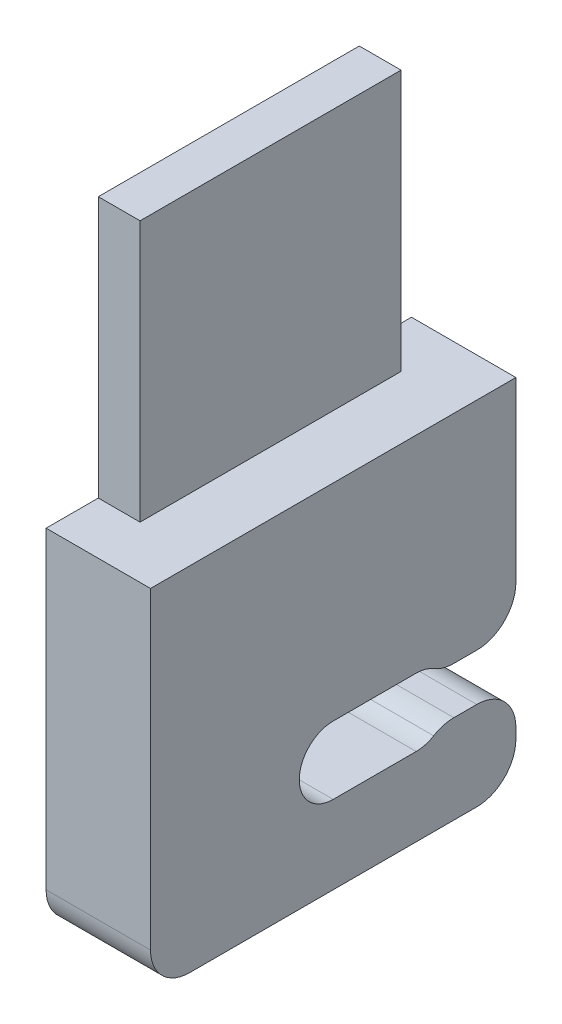
ISO-10303-21;
HEADER;
FILE_DESCRIPTION(('STEP AP214'),'2;1');
FILE_NAME('part.step','',(''),(''),'','','');
FILE_SCHEMA(('AUTOMOTIVE_DESIGN { 1 0 10303 214 1 1 1 1 }'));
ENDSEC;
DATA;
#1=APPLICATION_CONTEXT('core data for automotive mechanical design processes');
#2=APPLICATION_PROTOCOL_DEFINITION('international standard','automotive_design',2000,#1);
#3=PRODUCT_CONTEXT('',#1,'mechanical');
#4=PRODUCT('Part','Part','',(#3));
#5=PRODUCT_RELATED_PRODUCT_CATEGORY('part','',(#4));
#6=PRODUCT_DEFINITION_FORMATION('','',#4);
#7=PRODUCT_DEFINITION_CONTEXT('part definition',#1,'design');
#8=PRODUCT_DEFINITION('design','',#6,#7);
#9=PRODUCT_DEFINITION_SHAPE('','',#8);
#10=(LENGTH_UNIT() NAMED_UNIT(*) SI_UNIT(.MILLI.,.METRE.));
#11=(NAMED_UNIT(*) PLANE_ANGLE_UNIT() SI_UNIT($,.RADIAN.));
#12=(NAMED_UNIT(*) SI_UNIT($,.STERADIAN.) SOLID_ANGLE_UNIT());
#13=UNCERTAINTY_MEASURE_WITH_UNIT(LENGTH_MEASURE(1.E-05),#10,'distance_accuracy_value','');
#14=(GEOMETRIC_REPRESENTATION_CONTEXT(3) GLOBAL_UNCERTAINTY_ASSIGNED_CONTEXT((#13)) GLOBAL_UNIT_ASSIGNED_CONTEXT((#10,
#11,#12)) REPRESENTATION_CONTEXT('',''));
#15=CARTESIAN_POINT('',(0.,0.,0.));
#16=DIRECTION('',(0.,0.,1.));
#17=DIRECTION('',(1.,0.,0.));
#18=AXIS2_PLACEMENT_3D('',#15,#16,#17);
#19=CARTESIAN_POINT('',(1.6,0.,-10.));
#20=DIRECTION('',(0.,0.,1.));
#21=DIRECTION('',(0.,-1.,0.));
#22=AXIS2_PLACEMENT_3D('',#19,#20,#21);
#23=PLANE('',#22);
#24=DIRECTION('',(1.,0.,0.));
#25=VECTOR('',#24,1.);
#26=CARTESIAN_POINT('',(4.,-10.,-10.));
#27=LINE('',#26,#25);
#28=CARTESIAN_POINT('',(0.,-10.,-10.));
#29=VERTEX_POINT('',#28);
#30=CARTESIAN_POINT('',(1.6,-10.,-10.));
#31=VERTEX_POINT('',#30);
#32=EDGE_CURVE('E293',#29,#31,#27,.T.);
#33=ORIENTED_EDGE('',*,*,#32,.F.);
#34=DIRECTION('',(0.,1.,0.));
#35=VECTOR('',#34,1.);
#36=CARTESIAN_POINT('',(0.,0.,-10.));
#37=LINE('',#36,#35);
#38=CARTESIAN_POINT('',(0.,0.,-10.));
#39=VERTEX_POINT('',#38);
#40=EDGE_CURVE('E344',#29,#39,#37,.T.);
#41=ORIENTED_EDGE('',*,*,#40,.T.);
#42=DIRECTION('',(-1.,0.,0.));
#43=VECTOR('',#42,1.);
#44=CARTESIAN_POINT('',(1.6,0.,-10.));
#45=LINE('',#44,#43);
#46=CARTESIAN_POINT('',(1.6,0.,-10.));
#47=VERTEX_POINT('',#46);
#48=EDGE_CURVE('E319',#47,#39,#45,.T.);
#49=ORIENTED_EDGE('',*,*,#48,.F.);
#50=DIRECTION('',(0.,1.,0.));
#51=VECTOR('',#50,1.);
#52=CARTESIAN_POINT('',(1.6,0.,-10.));
#53=LINE('',#52,#51);
#54=EDGE_CURVE('E335',#31,#47,#53,.T.);
#55=ORIENTED_EDGE('',*,*,#54,.F.);
#56=EDGE_LOOP('',(#33,#41,#49,#55));
#57=FACE_BOUND('',#56,.T.);
#58=ADVANCED_FACE('F45',(#57),#23,.F.);
#59=CARTESIAN_POINT('',(1.6,0.,0.));
#60=DIRECTION('',(0.,0.,-1.));
#61=DIRECTION('',(-1.,0.,0.));
#62=AXIS2_PLACEMENT_3D('',#59,#60,#61);
#63=PLANE('',#62);
#64=DIRECTION('',(-1.,0.,0.));
#65=VECTOR('',#64,1.);
#66=CARTESIAN_POINT('',(4.,-10.,0.));
#67=LINE('',#66,#65);
#68=CARTESIAN_POINT('',(1.6,-10.,0.));
#69=VERTEX_POINT('',#68);
#70=CARTESIAN_POINT('',(0.,-10.,0.));
#71=VERTEX_POINT('',#70);
#72=EDGE_CURVE('E314',#69,#71,#67,.T.);
#73=ORIENTED_EDGE('',*,*,#72,.F.);
#74=DIRECTION('',(0.,-1.,0.));
#75=VECTOR('',#74,1.);
#76=CARTESIAN_POINT('',(1.6,0.,0.));
#77=LINE('',#76,#75);
#78=CARTESIAN_POINT('',(1.6,0.,0.));
#79=VERTEX_POINT('',#78);
#80=EDGE_CURVE('E326',#79,#69,#77,.T.);
#81=ORIENTED_EDGE('',*,*,#80,.F.);
#82=DIRECTION('',(-1.,0.,0.));
#83=VECTOR('',#82,1.);
#84=CARTESIAN_POINT('',(1.6,0.,0.));
#85=LINE('',#84,#83);
#86=CARTESIAN_POINT('',(0.,0.,0.));
#87=VERTEX_POINT('',#86);
#88=EDGE_CURVE('E341',#79,#87,#85,.T.);
#89=ORIENTED_EDGE('',*,*,#88,.T.);
#90=DIRECTION('',(0.,-1.,0.));
#91=VECTOR('',#90,1.);
#92=CARTESIAN_POINT('',(0.,0.,0.));
#93=LINE('',#92,#91);
#94=EDGE_CURVE('E325',#87,#71,#93,.T.);
#95=ORIENTED_EDGE('',*,*,#94,.T.);
#96=EDGE_LOOP('',(#73,#81,#89,#95));
#97=FACE_BOUND('',#96,.T.);
#98=ADVANCED_FACE('F494',(#97),#63,.F.);
#99=CARTESIAN_POINT('',(1.6,0.,0.));
#100=DIRECTION('',(0.,-1.,0.));
#101=DIRECTION('',(0.,0.,-1.));
#102=AXIS2_PLACEMENT_3D('',#99,#100,#101);
#103=PLANE('',#102);
#104=DIRECTION('',(0.,0.,1.));
#105=VECTOR('',#104,1.);
#106=CARTESIAN_POINT('',(0.,0.,0.));
#107=LINE('',#106,#105);
#108=EDGE_CURVE('E331',#39,#87,#107,.T.);
#109=ORIENTED_EDGE('',*,*,#108,.T.);
#110=ORIENTED_EDGE('',*,*,#88,.F.);
#111=DIRECTION('',(0.,0.,1.));
#112=VECTOR('',#111,1.);
#113=CARTESIAN_POINT('',(1.6,0.,0.));
#114=LINE('',#113,#112);
#115=EDGE_CURVE('E338',#47,#79,#114,.T.);
#116=ORIENTED_EDGE('',*,*,#115,.F.);
#117=ORIENTED_EDGE('',*,*,#48,.T.);
#118=EDGE_LOOP('',(#109,#110,#116,#117));
#119=FACE_BOUND('',#118,.T.);
#120=ADVANCED_FACE('F500',(#119),#103,.F.);
#121=CARTESIAN_POINT('',(1.6,0.,0.));
#122=DIRECTION('',(1.,0.,0.));
#123=DIRECTION('',(0.,0.,-1.));
#124=AXIS2_PLACEMENT_3D('',#121,#122,#123);
#125=PLANE('',#124);
#126=ORIENTED_EDGE('',*,*,#80,.T.);
#127=DIRECTION('',(0.,0.,-1.));
#128=VECTOR('',#127,1.);
#129=CARTESIAN_POINT('',(1.6,-10.,0.));
#130=LINE('',#129,#128);
#131=EDGE_CURVE('E330',#69,#31,#130,.T.);
#132=ORIENTED_EDGE('',*,*,#131,.T.);
#133=ORIENTED_EDGE('',*,*,#54,.T.);
#134=ORIENTED_EDGE('',*,*,#115,.T.);
#135=EDGE_LOOP('',(#126,#132,#133,#134));
#136=FACE_BOUND('',#135,.T.);
#137=ADVANCED_FACE('F606',(#136),#125,.T.);
#138=CARTESIAN_POINT('',(0.,0.,0.));
#139=DIRECTION('',(1.,0.,0.));
#140=DIRECTION('',(0.,0.,-1.));
#141=AXIS2_PLACEMENT_3D('',#138,#139,#140);
#142=PLANE('',#141);
#143=DIRECTION('',(0.,0.,1.));
#144=VECTOR('',#143,1.);
#145=CARTESIAN_POINT('',(0.,-18.3,0.));
#146=LINE('',#145,#144);
#147=CARTESIAN_POINT('',(0.,-18.3,-10.5));
#148=VERTEX_POINT('',#147);
#149=CARTESIAN_POINT('',(0.,-18.3,-9.6222205101856));
#150=VERTEX_POINT('',#149);
#151=EDGE_CURVE('E234',#148,#150,#146,.T.);
#152=ORIENTED_EDGE('',*,*,#151,.T.);
#153=CARTESIAN_POINT('',(0.,-16.8,-9.6222205101856));
#154=DIRECTION('',(1.,0.,0.));
#155=DIRECTION('',(0.,0.,-1.));
#156=AXIS2_PLACEMENT_3D('',#153,#154,#155);
#157=CIRCLE('',#156,1.5);
#158=CARTESIAN_POINT('',(0.,-18.0857142857143,-8.84960237972903));
#159=VERTEX_POINT('',#158);
#160=EDGE_CURVE('E384',#150,#159,#157,.F.);
#161=ORIENTED_EDGE('',*,*,#160,.T.);
#162=CARTESIAN_POINT('',(0.,-19.2,-8.18));
#163=DIRECTION('',(1.,0.,0.));
#164=DIRECTION('',(0.,0.,-1.));
#165=AXIS2_PLACEMENT_3D('',#162,#163,#164);
#166=CIRCLE('',#165,1.3);
#167=CARTESIAN_POINT('',(0.,-17.9,-8.18));
#168=VERTEX_POINT('',#167);
#169=EDGE_CURVE('E443',#168,#159,#166,.F.);
#170=ORIENTED_EDGE('',*,*,#169,.F.);
#171=DIRECTION('',(0.,0.,1.));
#172=VECTOR('',#171,1.);
#173=CARTESIAN_POINT('',(0.,-17.9,0.));
#174=LINE('',#173,#172);
#175=CARTESIAN_POINT('',(0.,-17.9,-5.));
#176=VERTEX_POINT('',#175);
#177=EDGE_CURVE('E441',#168,#176,#174,.T.);
#178=ORIENTED_EDGE('',*,*,#177,.T.);
#179=CARTESIAN_POINT('',(0.,-19.2,-5.));
#180=DIRECTION('',(1.,0.,0.));
#181=DIRECTION('',(0.,0.,-1.));
#182=AXIS2_PLACEMENT_3D('',#179,#180,#181);
#183=CIRCLE('',#182,1.3);
#184=CARTESIAN_POINT('',(0.,-20.5,-5.));
#185=VERTEX_POINT('',#184);
#186=EDGE_CURVE('E437',#185,#176,#183,.F.);
#187=ORIENTED_EDGE('',*,*,#186,.F.);
#188=DIRECTION('',(0.,0.,1.));
#189=VECTOR('',#188,1.);
#190=CARTESIAN_POINT('',(0.,-20.5,0.));
#191=LINE('',#190,#189);
#192=CARTESIAN_POINT('',(0.,-20.5,-8.18));
#193=VERTEX_POINT('',#192);
#194=EDGE_CURVE('E433',#193,#185,#191,.T.);
#195=ORIENTED_EDGE('',*,*,#194,.F.);
#196=CARTESIAN_POINT('',(0.,-19.2,-8.18));
#197=DIRECTION('',(1.,0.,0.));
#198=DIRECTION('',(0.,0.,-1.));
#199=AXIS2_PLACEMENT_3D('',#196,#197,#198);
#200=CIRCLE('',#199,1.3);
#201=CARTESIAN_POINT('',(0.,-20.3142857142857,-8.84960237972903));
#202=VERTEX_POINT('',#201);
#203=EDGE_CURVE('E408',#202,#193,#200,.F.);
#204=ORIENTED_EDGE('',*,*,#203,.F.);
#205=CARTESIAN_POINT('',(0.,-21.6,-9.62222051018559));
#206=DIRECTION('',(1.,0.,0.));
#207=DIRECTION('',(0.,0.,-1.));
#208=AXIS2_PLACEMENT_3D('',#205,#206,#207);
#209=CIRCLE('',#208,1.5);
#210=CARTESIAN_POINT('',(0.,-20.1,-9.62222051018559));
#211=VERTEX_POINT('',#210);
#212=EDGE_CURVE('E67',#202,#211,#209,.F.);
#213=ORIENTED_EDGE('',*,*,#212,.T.);
#214=DIRECTION('',(0.,0.,1.));
#215=VECTOR('',#214,1.);
#216=CARTESIAN_POINT('',(0.,-20.1,0.));
#217=LINE('',#216,#215);
#218=CARTESIAN_POINT('',(0.,-20.1,-10.5));
#219=VERTEX_POINT('',#218);
#220=EDGE_CURVE('E401',#219,#211,#217,.T.);
#221=ORIENTED_EDGE('',*,*,#220,.F.);
#222=CARTESIAN_POINT('',(0.,-21.6,-10.5));
#223=DIRECTION('',(1.,0.,0.));
#224=DIRECTION('',(0.,0.,-1.));
#225=AXIS2_PLACEMENT_3D('',#222,#223,#224);
#226=CIRCLE('',#225,1.5);
#227=CARTESIAN_POINT('',(0.,-21.6,-12.));
#228=VERTEX_POINT('',#227);
#229=EDGE_CURVE('E61',#219,#228,#226,.F.);
#230=ORIENTED_EDGE('',*,*,#229,.T.);
#231=DIRECTION('',(0.,1.,0.));
#232=VECTOR('',#231,1.);
#233=CARTESIAN_POINT('',(0.,0.,-12.));
#234=LINE('',#233,#232);
#235=CARTESIAN_POINT('',(0.,-22.,-12.));
#236=VERTEX_POINT('',#235);
#237=EDGE_CURVE('E409',#236,#228,#234,.T.);
#238=ORIENTED_EDGE('',*,*,#237,.F.);
#239=CARTESIAN_POINT('',(0.,-22.,-10.5));
#240=DIRECTION('',(1.,0.,0.));
#241=DIRECTION('',(0.,0.,-1.));
#242=AXIS2_PLACEMENT_3D('',#239,#240,#241);
#243=CIRCLE('',#242,1.5);
#244=CARTESIAN_POINT('',(0.,-23.5,-10.5));
#245=VERTEX_POINT('',#244);
#246=EDGE_CURVE('E422',#236,#245,#243,.F.);
#247=ORIENTED_EDGE('',*,*,#246,.T.);
#248=DIRECTION('',(0.,0.,1.));
#249=VECTOR('',#248,1.);
#250=CARTESIAN_POINT('',(0.,-23.5,0.));
#251=LINE('',#250,#249);
#252=CARTESIAN_POINT('',(0.,-23.5,0.499999999999999));
#253=VERTEX_POINT('',#252);
#254=EDGE_CURVE('E271',#245,#253,#251,.T.);
#255=ORIENTED_EDGE('',*,*,#254,.T.);
#256=CARTESIAN_POINT('',(0.,-22.,0.499999999999999));
#257=DIRECTION('',(1.,0.,0.));
#258=DIRECTION('',(0.,0.,-1.));
#259=AXIS2_PLACEMENT_3D('',#256,#257,#258);
#260=CIRCLE('',#259,1.5);
#261=CARTESIAN_POINT('',(0.,-22.,2.));
#262=VERTEX_POINT('',#261);
#263=EDGE_CURVE('E290',#253,#262,#260,.F.);
#264=ORIENTED_EDGE('',*,*,#263,.T.);
#265=DIRECTION('',(0.,-1.,0.));
#266=VECTOR('',#265,1.);
#267=CARTESIAN_POINT('',(0.,-10.,2.));
#268=LINE('',#267,#266);
#269=CARTESIAN_POINT('',(0.,-10.,2.));
#270=VERTEX_POINT('',#269);
#271=EDGE_CURVE('E216',#270,#262,#268,.T.);
#272=ORIENTED_EDGE('',*,*,#271,.F.);
#273=DIRECTION('',(0.,0.,-1.));
#274=VECTOR('',#273,1.);
#275=CARTESIAN_POINT('',(0.,-10.,2.));
#276=LINE('',#275,#274);
#277=EDGE_CURVE('E313',#270,#71,#276,.T.);
#278=ORIENTED_EDGE('',*,*,#277,.T.);
#279=ORIENTED_EDGE('',*,*,#94,.F.);
#280=ORIENTED_EDGE('',*,*,#108,.F.);
#281=ORIENTED_EDGE('',*,*,#40,.F.);
#282=DIRECTION('',(0.,0.,1.));
#283=VECTOR('',#282,1.);
#284=CARTESIAN_POINT('',(0.,-10.,-12.));
#285=LINE('',#284,#283);
#286=CARTESIAN_POINT('',(0.,-10.,-12.));
#287=VERTEX_POINT('',#286);
#288=EDGE_CURVE('E210',#287,#29,#285,.T.);
#289=ORIENTED_EDGE('',*,*,#288,.F.);
#290=DIRECTION('',(0.,1.,0.));
#291=VECTOR('',#290,1.);
#292=CARTESIAN_POINT('',(0.,-10.,-12.));
#293=LINE('',#292,#291);
#294=CARTESIAN_POINT('',(0.,-16.8,-12.));
#295=VERTEX_POINT('',#294);
#296=EDGE_CURVE('E298',#295,#287,#293,.T.);
#297=ORIENTED_EDGE('',*,*,#296,.F.);
#298=CARTESIAN_POINT('',(0.,-16.8,-10.5));
#299=DIRECTION('',(1.,0.,0.));
#300=DIRECTION('',(0.,0.,-1.));
#301=AXIS2_PLACEMENT_3D('',#298,#299,#300);
#302=CIRCLE('',#301,1.5);
#303=EDGE_CURVE('E381',#295,#148,#302,.F.);
#304=ORIENTED_EDGE('',*,*,#303,.T.);
#305=EDGE_LOOP('',(#152,#161,#170,#178,#187,#195,#204,#213,#221,#230,#238,#247,#255,#264,#272,
#278,#279,#280,#281,#289,#297,#304));
#306=FACE_BOUND('',#305,.T.);
#307=ADVANCED_FACE('F406',(#306),#142,.F.);
#308=CARTESIAN_POINT('',(4.,0.,-14.4721359549996));
#309=DIRECTION('',(-1.,0.,0.));
#310=DIRECTION('',(0.,-1.,0.));
#311=AXIS2_PLACEMENT_3D('',#308,#309,#310);
#312=PLANE('',#311);
#313=CARTESIAN_POINT('',(4.,-19.2,-8.18));
#314=DIRECTION('',(1.,0.,0.));
#315=DIRECTION('',(0.,1.,0.));
#316=AXIS2_PLACEMENT_3D('',#313,#314,#315);
#317=CIRCLE('',#316,1.3);
#318=CARTESIAN_POINT('',(4.,-18.0857142857143,-8.84960237972903));
#319=VERTEX_POINT('',#318);
#320=CARTESIAN_POINT('',(4.,-17.9,-8.18));
#321=VERTEX_POINT('',#320);
#322=EDGE_CURVE('E252',#319,#321,#317,.T.);
#323=ORIENTED_EDGE('',*,*,#322,.F.);
#324=CARTESIAN_POINT('',(4.,-16.8,-9.6222205101856));
#325=DIRECTION('',(-1.,0.,0.));
#326=DIRECTION('',(0.,-1.,0.));
#327=AXIS2_PLACEMENT_3D('',#324,#325,#326);
#328=CIRCLE('',#327,1.5);
#329=CARTESIAN_POINT('',(4.,-18.3,-9.6222205101856));
#330=VERTEX_POINT('',#329);
#331=EDGE_CURVE('E367',#319,#330,#328,.F.);
#332=ORIENTED_EDGE('',*,*,#331,.T.);
#333=DIRECTION('',(0.,0.,-1.));
#334=VECTOR('',#333,1.);
#335=CARTESIAN_POINT('',(4.,-18.3,0.));
#336=LINE('',#335,#334);
#337=CARTESIAN_POINT('',(4.,-18.3,-10.5));
#338=VERTEX_POINT('',#337);
#339=EDGE_CURVE('E222',#330,#338,#336,.T.);
#340=ORIENTED_EDGE('',*,*,#339,.T.);
#341=CARTESIAN_POINT('',(4.,-16.8,-10.5));
#342=DIRECTION('',(-1.,0.,0.));
#343=DIRECTION('',(0.,-1.,0.));
#344=AXIS2_PLACEMENT_3D('',#341,#342,#343);
#345=CIRCLE('',#344,1.5);
#346=CARTESIAN_POINT('',(4.,-16.8,-12.));
#347=VERTEX_POINT('',#346);
#348=EDGE_CURVE('E364',#338,#347,#345,.F.);
#349=ORIENTED_EDGE('',*,*,#348,.T.);
#350=DIRECTION('',(0.,-1.,0.));
#351=VECTOR('',#350,1.);
#352=CARTESIAN_POINT('',(4.,-10.,-12.));
#353=LINE('',#352,#351);
#354=CARTESIAN_POINT('',(4.,-10.,-12.));
#355=VERTEX_POINT('',#354);
#356=EDGE_CURVE('E294',#355,#347,#353,.T.);
#357=ORIENTED_EDGE('',*,*,#356,.F.);
#358=DIRECTION('',(0.,0.,1.));
#359=VECTOR('',#358,1.);
#360=CARTESIAN_POINT('',(4.,-10.,-14.4721359549996));
#361=LINE('',#360,#359);
#362=CARTESIAN_POINT('',(4.,-10.,2.));
#363=VERTEX_POINT('',#362);
#364=EDGE_CURVE('E205',#355,#363,#361,.T.);
#365=ORIENTED_EDGE('',*,*,#364,.T.);
#366=DIRECTION('',(0.,1.,0.));
#367=VECTOR('',#366,1.);
#368=CARTESIAN_POINT('',(4.,-10.,2.));
#369=LINE('',#368,#367);
#370=CARTESIAN_POINT('',(3.99999999999999,-22.,2.));
#371=VERTEX_POINT('',#370);
#372=EDGE_CURVE('E197',#371,#363,#369,.T.);
#373=ORIENTED_EDGE('',*,*,#372,.F.);
#374=CARTESIAN_POINT('',(3.99999999999999,-22.,0.499999999999999));
#375=DIRECTION('',(1.,0.,0.));
#376=DIRECTION('',(0.,1.,0.));
#377=AXIS2_PLACEMENT_3D('',#374,#375,#376);
#378=CIRCLE('',#377,1.5);
#379=CARTESIAN_POINT('',(3.99999999999999,-23.5,0.499999999999999));
#380=VERTEX_POINT('',#379);
#381=EDGE_CURVE('E203',#371,#380,#378,.T.);
#382=ORIENTED_EDGE('',*,*,#381,.T.);
#383=DIRECTION('',(0.,0.,-1.));
#384=VECTOR('',#383,1.);
#385=CARTESIAN_POINT('',(3.99999999999999,-23.5,0.));
#386=LINE('',#385,#384);
#387=CARTESIAN_POINT('',(3.99999999999999,-23.5,-10.5));
#388=VERTEX_POINT('',#387);
#389=EDGE_CURVE('E228',#380,#388,#386,.T.);
#390=ORIENTED_EDGE('',*,*,#389,.T.);
#391=CARTESIAN_POINT('',(3.99999999999999,-22.,-10.5));
#392=DIRECTION('',(1.,0.,0.));
#393=DIRECTION('',(0.,1.,0.));
#394=AXIS2_PLACEMENT_3D('',#391,#392,#393);
#395=CIRCLE('',#394,1.5);
#396=CARTESIAN_POINT('',(3.99999999999999,-22.,-12.));
#397=VERTEX_POINT('',#396);
#398=EDGE_CURVE('E231',#388,#397,#395,.T.);
#399=ORIENTED_EDGE('',*,*,#398,.T.);
#400=DIRECTION('',(0.,-1.,0.));
#401=VECTOR('',#400,1.);
#402=CARTESIAN_POINT('',(4.00000000000001,0.,-12.));
#403=LINE('',#402,#401);
#404=CARTESIAN_POINT('',(4.,-21.6,-12.));
#405=VERTEX_POINT('',#404);
#406=EDGE_CURVE('E240',#405,#397,#403,.T.);
#407=ORIENTED_EDGE('',*,*,#406,.F.);
#408=CARTESIAN_POINT('',(3.99999999999999,-21.6,-10.5));
#409=DIRECTION('',(-1.,0.,0.));
#410=DIRECTION('',(0.,-1.,0.));
#411=AXIS2_PLACEMENT_3D('',#408,#409,#410);
#412=CIRCLE('',#411,1.5);
#413=CARTESIAN_POINT('',(4.,-20.1,-10.5));
#414=VERTEX_POINT('',#413);
#415=EDGE_CURVE('E361',#405,#414,#412,.F.);
#416=ORIENTED_EDGE('',*,*,#415,.T.);
#417=DIRECTION('',(0.,0.,-1.));
#418=VECTOR('',#417,1.);
#419=CARTESIAN_POINT('',(4.,-20.1,0.));
#420=LINE('',#419,#418);
#421=CARTESIAN_POINT('',(4.,-20.1,-9.62222051018559));
#422=VERTEX_POINT('',#421);
#423=EDGE_CURVE('E243',#422,#414,#420,.T.);
#424=ORIENTED_EDGE('',*,*,#423,.F.);
#425=CARTESIAN_POINT('',(3.99999999999999,-21.6,-9.62222051018559));
#426=DIRECTION('',(-1.,0.,0.));
#427=DIRECTION('',(0.,-1.,0.));
#428=AXIS2_PLACEMENT_3D('',#425,#426,#427);
#429=CIRCLE('',#428,1.5);
#430=CARTESIAN_POINT('',(4.,-20.3142857142857,-8.84960237972903));
#431=VERTEX_POINT('',#430);
#432=EDGE_CURVE('E358',#422,#431,#429,.F.);
#433=ORIENTED_EDGE('',*,*,#432,.T.);
#434=CARTESIAN_POINT('',(4.,-20.5,-8.18));
#435=VERTEX_POINT('',#434);
#436=EDGE_CURVE('E247',#435,#431,#317,.T.);
#437=ORIENTED_EDGE('',*,*,#436,.F.);
#438=DIRECTION('',(0.,0.,-1.));
#439=VECTOR('',#438,1.);
#440=CARTESIAN_POINT('',(4.,-20.5,0.));
#441=LINE('',#440,#439);
#442=CARTESIAN_POINT('',(4.,-20.5,-5.));
#443=VERTEX_POINT('',#442);
#444=EDGE_CURVE('E251',#443,#435,#441,.T.);
#445=ORIENTED_EDGE('',*,*,#444,.F.);
#446=CARTESIAN_POINT('',(4.,-19.2,-5.));
#447=DIRECTION('',(1.,0.,0.));
#448=DIRECTION('',(0.,1.,0.));
#449=AXIS2_PLACEMENT_3D('',#446,#447,#448);
#450=CIRCLE('',#449,1.3);
#451=CARTESIAN_POINT('',(4.,-17.9,-5.));
#452=VERTEX_POINT('',#451);
#453=EDGE_CURVE('E256',#452,#443,#450,.T.);
#454=ORIENTED_EDGE('',*,*,#453,.F.);
#455=DIRECTION('',(0.,0.,-1.));
#456=VECTOR('',#455,1.);
#457=CARTESIAN_POINT('',(4.,-17.9,0.));
#458=LINE('',#457,#456);
#459=EDGE_CURVE('E260',#452,#321,#458,.T.);
#460=ORIENTED_EDGE('',*,*,#459,.T.);
#461=EDGE_LOOP('',(#323,#332,#340,#349,#357,#365,#373,#382,#390,#399,#407,#416,#424,#433,#437,
#445,#454,#460));
#462=FACE_BOUND('',#461,.T.);
#463=ADVANCED_FACE('F200',(#462),#312,.F.);
#464=CARTESIAN_POINT('',(0.,-10.,-14.4721359549996));
#465=DIRECTION('',(0.,-1.,0.));
#466=DIRECTION('',(0.,0.,-1.));
#467=AXIS2_PLACEMENT_3D('',#464,#465,#466);
#468=PLANE('',#467);
#469=ORIENTED_EDGE('',*,*,#131,.F.);
#470=ORIENTED_EDGE('',*,*,#72,.T.);
#471=ORIENTED_EDGE('',*,*,#277,.F.);
#472=DIRECTION('',(-1.,0.,0.));
#473=VECTOR('',#472,1.);
#474=CARTESIAN_POINT('',(4.,-10.,2.));
#475=LINE('',#474,#473);
#476=EDGE_CURVE('E209',#363,#270,#475,.T.);
#477=ORIENTED_EDGE('',*,*,#476,.F.);
#478=ORIENTED_EDGE('',*,*,#364,.F.);
#479=DIRECTION('',(1.,0.,0.));
#480=VECTOR('',#479,1.);
#481=CARTESIAN_POINT('',(4.,-10.,-12.));
#482=LINE('',#481,#480);
#483=EDGE_CURVE('E301',#287,#355,#482,.T.);
#484=ORIENTED_EDGE('',*,*,#483,.F.);
#485=ORIENTED_EDGE('',*,*,#288,.T.);
#486=ORIENTED_EDGE('',*,*,#32,.T.);
#487=EDGE_LOOP('',(#469,#470,#471,#477,#478,#484,#485,#486));
#488=FACE_BOUND('',#487,.T.);
#489=ADVANCED_FACE('F595',(#488),#468,.F.);
#490=CARTESIAN_POINT('',(0.,0.,2.));
#491=DIRECTION('',(0.,0.,-1.));
#492=DIRECTION('',(-1.,0.,0.));
#493=AXIS2_PLACEMENT_3D('',#490,#491,#492);
#494=PLANE('',#493);
#495=ORIENTED_EDGE('',*,*,#372,.T.);
#496=ORIENTED_EDGE('',*,*,#476,.T.);
#497=ORIENTED_EDGE('',*,*,#271,.T.);
#498=DIRECTION('',(1.,0.,0.));
#499=VECTOR('',#498,1.);
#500=CARTESIAN_POINT('',(-18.1176709319934,-22.,2.));
#501=LINE('',#500,#499);
#502=EDGE_CURVE('E213',#262,#371,#501,.T.);
#503=ORIENTED_EDGE('',*,*,#502,.T.);
#504=EDGE_LOOP('',(#495,#496,#497,#503));
#505=FACE_BOUND('',#504,.T.);
#506=ADVANCED_FACE('F214',(#505),#494,.F.);
#507=CARTESIAN_POINT('',(0.,0.,-12.));
#508=DIRECTION('',(0.,0.,-1.));
#509=DIRECTION('',(-1.,0.,0.));
#510=AXIS2_PLACEMENT_3D('',#507,#508,#509);
#511=PLANE('',#510);
#512=ORIENTED_EDGE('',*,*,#356,.T.);
#513=DIRECTION('',(1.,0.,0.));
#514=VECTOR('',#513,1.);
#515=CARTESIAN_POINT('',(0.,-16.8,-12.));
#516=LINE('',#515,#514);
#517=EDGE_CURVE('E387',#347,#295,#516,.F.);
#518=ORIENTED_EDGE('',*,*,#517,.T.);
#519=ORIENTED_EDGE('',*,*,#296,.T.);
#520=ORIENTED_EDGE('',*,*,#483,.T.);
#521=EDGE_LOOP('',(#512,#518,#519,#520));
#522=FACE_BOUND('',#521,.T.);
#523=ADVANCED_FACE('F574',(#522),#511,.T.);
#524=CARTESIAN_POINT('',(-18.1176709319934,-18.3,0.));
#525=DIRECTION('',(0.,-1.,0.));
#526=DIRECTION('',(1.,0.,0.));
#527=AXIS2_PLACEMENT_3D('',#524,#525,#526);
#528=PLANE('',#527);
#529=ORIENTED_EDGE('',*,*,#339,.F.);
#530=DIRECTION('',(-1.,0.,0.));
#531=VECTOR('',#530,1.);
#532=CARTESIAN_POINT('',(0.,-18.3,-9.6222205101856));
#533=LINE('',#532,#531);
#534=EDGE_CURVE('E374',#330,#150,#533,.T.);
#535=ORIENTED_EDGE('',*,*,#534,.T.);
#536=ORIENTED_EDGE('',*,*,#151,.F.);
#537=DIRECTION('',(1.,0.,0.));
#538=VECTOR('',#537,1.);
#539=CARTESIAN_POINT('',(-18.1176709319934,-18.3,-10.5));
#540=LINE('',#539,#538);
#541=EDGE_CURVE('E370',#148,#338,#540,.T.);
#542=ORIENTED_EDGE('',*,*,#541,.T.);
#543=EDGE_LOOP('',(#529,#535,#536,#542));
#544=FACE_BOUND('',#543,.T.);
#545=ADVANCED_FACE('F492',(#544),#528,.T.);
#546=CARTESIAN_POINT('',(-18.1176709319934,-19.2,-8.18));
#547=DIRECTION('',(1.,0.,0.));
#548=DIRECTION('',(0.,1.,0.));
#549=AXIS2_PLACEMENT_3D('',#546,#547,#548);
#550=CYLINDRICAL_SURFACE('',#549,1.3);
#551=ORIENTED_EDGE('',*,*,#169,.T.);
#552=DIRECTION('',(1.,0.,0.));
#553=VECTOR('',#552,1.);
#554=CARTESIAN_POINT('',(-18.1176709319934,-18.0857142857143,-8.84960237972903));
#555=LINE('',#554,#553);
#556=EDGE_CURVE('E318',#159,#319,#555,.T.);
#557=ORIENTED_EDGE('',*,*,#556,.T.);
#558=ORIENTED_EDGE('',*,*,#322,.T.);
#559=DIRECTION('',(1.,0.,0.));
#560=VECTOR('',#559,1.);
#561=CARTESIAN_POINT('',(-18.1176709319934,-17.9,-8.18));
#562=LINE('',#561,#560);
#563=EDGE_CURVE('E267',#168,#321,#562,.T.);
#564=ORIENTED_EDGE('',*,*,#563,.F.);
#565=EDGE_LOOP('',(#551,#557,#558,#564));
#566=FACE_BOUND('',#565,.T.);
#567=ADVANCED_FACE('F459',(#566),#550,.F.);
#568=CARTESIAN_POINT('',(-18.1176709319934,-17.9,0.));
#569=DIRECTION('',(0.,-1.,0.));
#570=DIRECTION('',(1.,0.,0.));
#571=AXIS2_PLACEMENT_3D('',#568,#569,#570);
#572=PLANE('',#571);
#573=ORIENTED_EDGE('',*,*,#177,.F.);
#574=ORIENTED_EDGE('',*,*,#563,.T.);
#575=ORIENTED_EDGE('',*,*,#459,.F.);
#576=DIRECTION('',(1.,0.,0.));
#577=VECTOR('',#576,1.);
#578=CARTESIAN_POINT('',(-18.1176709319934,-17.9,-5.));
#579=LINE('',#578,#577);
#580=EDGE_CURVE('E272',#176,#452,#579,.T.);
#581=ORIENTED_EDGE('',*,*,#580,.F.);
#582=EDGE_LOOP('',(#573,#574,#575,#581));
#583=FACE_BOUND('',#582,.T.);
#584=ADVANCED_FACE('F468',(#583),#572,.T.);
#585=CARTESIAN_POINT('',(-18.1176709319934,-19.2,-5.));
#586=DIRECTION('',(1.,0.,0.));
#587=DIRECTION('',(0.,1.,0.));
#588=AXIS2_PLACEMENT_3D('',#585,#586,#587);
#589=CYLINDRICAL_SURFACE('',#588,1.3);
#590=DIRECTION('',(1.,0.,0.));
#591=VECTOR('',#590,1.);
#592=CARTESIAN_POINT('',(-18.1176709319934,-20.5,-5.));
#593=LINE('',#592,#591);
#594=EDGE_CURVE('E275',#185,#443,#593,.T.);
#595=ORIENTED_EDGE('',*,*,#594,.F.);
#596=ORIENTED_EDGE('',*,*,#186,.T.);
#597=ORIENTED_EDGE('',*,*,#580,.T.);
#598=ORIENTED_EDGE('',*,*,#453,.T.);
#599=EDGE_LOOP('',(#595,#596,#597,#598));
#600=FACE_BOUND('',#599,.T.);
#601=ADVANCED_FACE('F472',(#600),#589,.F.);
#602=CARTESIAN_POINT('',(-18.1176709319934,-20.5,0.));
#603=DIRECTION('',(0.,-1.,0.));
#604=DIRECTION('',(1.,0.,0.));
#605=AXIS2_PLACEMENT_3D('',#602,#603,#604);
#606=PLANE('',#605);
#607=DIRECTION('',(1.,0.,0.));
#608=VECTOR('',#607,1.);
#609=CARTESIAN_POINT('',(-18.1176709319934,-20.5,-8.18));
#610=LINE('',#609,#608);
#611=EDGE_CURVE('E278',#193,#435,#610,.T.);
#612=ORIENTED_EDGE('',*,*,#611,.F.);
#613=ORIENTED_EDGE('',*,*,#194,.T.);
#614=ORIENTED_EDGE('',*,*,#594,.T.);
#615=ORIENTED_EDGE('',*,*,#444,.T.);
#616=EDGE_LOOP('',(#612,#613,#614,#615));
#617=FACE_BOUND('',#616,.T.);
#618=ADVANCED_FACE('F475',(#617),#606,.F.);
#619=ORIENTED_EDGE('',*,*,#436,.T.);
#620=DIRECTION('',(1.,0.,0.));
#621=VECTOR('',#620,1.);
#622=CARTESIAN_POINT('',(-18.1176709319934,-20.3142857142857,-8.84960237972903));
#623=LINE('',#622,#621);
#624=EDGE_CURVE('E11',#431,#202,#623,.F.);
#625=ORIENTED_EDGE('',*,*,#624,.T.);
#626=ORIENTED_EDGE('',*,*,#203,.T.);
#627=ORIENTED_EDGE('',*,*,#611,.T.);
#628=EDGE_LOOP('',(#619,#625,#626,#627));
#629=FACE_BOUND('',#628,.T.);
#630=ADVANCED_FACE('F480',(#629),#550,.F.);
#631=CARTESIAN_POINT('',(-18.1176709319934,-20.1,0.));
#632=DIRECTION('',(0.,-1.,0.));
#633=DIRECTION('',(1.,0.,0.));
#634=AXIS2_PLACEMENT_3D('',#631,#632,#633);
#635=PLANE('',#634);
#636=ORIENTED_EDGE('',*,*,#423,.T.);
#637=DIRECTION('',(1.,0.,0.));
#638=VECTOR('',#637,1.);
#639=CARTESIAN_POINT('',(-18.1176709319934,-20.1,-10.5));
#640=LINE('',#639,#638);
#641=EDGE_CURVE('E54',#414,#219,#640,.F.);
#642=ORIENTED_EDGE('',*,*,#641,.T.);
#643=ORIENTED_EDGE('',*,*,#220,.T.);
#644=DIRECTION('',(1.,0.,0.));
#645=VECTOR('',#644,1.);
#646=CARTESIAN_POINT('',(-18.1176709319934,-20.1,-9.62222051018559));
#647=LINE('',#646,#645);
#648=EDGE_CURVE('E394',#211,#422,#647,.T.);
#649=ORIENTED_EDGE('',*,*,#648,.T.);
#650=EDGE_LOOP('',(#636,#642,#643,#649));
#651=FACE_BOUND('',#650,.T.);
#652=ADVANCED_FACE('F400',(#651),#635,.F.);
#653=CARTESIAN_POINT('',(-18.1176709319934,0.,-12.));
#654=DIRECTION('',(0.,0.,1.));
#655=DIRECTION('',(1.,0.,0.));
#656=AXIS2_PLACEMENT_3D('',#653,#654,#655);
#657=PLANE('',#656);
#658=ORIENTED_EDGE('',*,*,#237,.T.);
#659=DIRECTION('',(1.,0.,0.));
#660=VECTOR('',#659,1.);
#661=CARTESIAN_POINT('',(-18.1176709319934,-21.6,-12.));
#662=LINE('',#661,#660);
#663=EDGE_CURVE('E390',#228,#405,#662,.T.);
#664=ORIENTED_EDGE('',*,*,#663,.T.);
#665=ORIENTED_EDGE('',*,*,#406,.T.);
#666=DIRECTION('',(1.,0.,0.));
#667=VECTOR('',#666,1.);
#668=CARTESIAN_POINT('',(-18.1176709319934,-22.,-12.));
#669=LINE('',#668,#667);
#670=EDGE_CURVE('E281',#236,#397,#669,.T.);
#671=ORIENTED_EDGE('',*,*,#670,.F.);
#672=EDGE_LOOP('',(#658,#664,#665,#671));
#673=FACE_BOUND('',#672,.T.);
#674=ADVANCED_FACE('F415',(#673),#657,.F.);
#675=CARTESIAN_POINT('',(-18.1176709319934,-22.,-10.5));
#676=DIRECTION('',(1.,0.,0.));
#677=DIRECTION('',(0.,1.,0.));
#678=AXIS2_PLACEMENT_3D('',#675,#676,#677);
#679=CYLINDRICAL_SURFACE('',#678,1.5);
#680=ORIENTED_EDGE('',*,*,#246,.F.);
#681=ORIENTED_EDGE('',*,*,#670,.T.);
#682=ORIENTED_EDGE('',*,*,#398,.F.);
#683=DIRECTION('',(1.,0.,0.));
#684=VECTOR('',#683,1.);
#685=CARTESIAN_POINT('',(-18.1176709319934,-23.5,-10.5));
#686=LINE('',#685,#684);
#687=EDGE_CURVE('E285',#245,#388,#686,.T.);
#688=ORIENTED_EDGE('',*,*,#687,.F.);
#689=EDGE_LOOP('',(#680,#681,#682,#688));
#690=FACE_BOUND('',#689,.T.);
#691=ADVANCED_FACE('F421',(#690),#679,.T.);
#692=CARTESIAN_POINT('',(-18.1176709319934,-23.5,0.));
#693=DIRECTION('',(0.,-1.,0.));
#694=DIRECTION('',(1.,0.,0.));
#695=AXIS2_PLACEMENT_3D('',#692,#693,#694);
#696=PLANE('',#695);
#697=ORIENTED_EDGE('',*,*,#254,.F.);
#698=ORIENTED_EDGE('',*,*,#687,.T.);
#699=ORIENTED_EDGE('',*,*,#389,.F.);
#700=DIRECTION('',(1.,0.,0.));
#701=VECTOR('',#700,1.);
#702=CARTESIAN_POINT('',(-18.1176709319934,-23.5,0.499999999999999));
#703=LINE('',#702,#701);
#704=EDGE_CURVE('E221',#253,#380,#703,.T.);
#705=ORIENTED_EDGE('',*,*,#704,.F.);
#706=EDGE_LOOP('',(#697,#698,#699,#705));
#707=FACE_BOUND('',#706,.T.);
#708=ADVANCED_FACE('F613',(#707),#696,.T.);
#709=CARTESIAN_POINT('',(-18.1176709319934,-22.,0.499999999999999));
#710=DIRECTION('',(1.,0.,0.));
#711=DIRECTION('',(0.,1.,0.));
#712=AXIS2_PLACEMENT_3D('',#709,#710,#711);
#713=CYLINDRICAL_SURFACE('',#712,1.5);
#714=ORIENTED_EDGE('',*,*,#263,.F.);
#715=ORIENTED_EDGE('',*,*,#704,.T.);
#716=ORIENTED_EDGE('',*,*,#381,.F.);
#717=ORIENTED_EDGE('',*,*,#502,.F.);
#718=EDGE_LOOP('',(#714,#715,#716,#717));
#719=FACE_BOUND('',#718,.T.);
#720=ADVANCED_FACE('F224',(#719),#713,.T.);
#721=CARTESIAN_POINT('',(-18.1176709319934,-16.8,-9.6222205101856));
#722=DIRECTION('',(1.,0.,0.));
#723=DIRECTION('',(0.,1.,0.));
#724=AXIS2_PLACEMENT_3D('',#721,#722,#723);
#725=CYLINDRICAL_SURFACE('',#724,1.5);
#726=ORIENTED_EDGE('',*,*,#160,.F.);
#727=ORIENTED_EDGE('',*,*,#534,.F.);
#728=ORIENTED_EDGE('',*,*,#331,.F.);
#729=ORIENTED_EDGE('',*,*,#556,.F.);
#730=EDGE_LOOP('',(#726,#727,#728,#729));
#731=FACE_BOUND('',#730,.T.);
#732=ADVANCED_FACE('F458',(#731),#725,.T.);
#733=CARTESIAN_POINT('',(-18.1176709319934,-16.8,-10.5));
#734=DIRECTION('',(1.,0.,0.));
#735=DIRECTION('',(0.,1.,0.));
#736=AXIS2_PLACEMENT_3D('',#733,#734,#735);
#737=CYLINDRICAL_SURFACE('',#736,1.5);
#738=ORIENTED_EDGE('',*,*,#303,.F.);
#739=ORIENTED_EDGE('',*,*,#517,.F.);
#740=ORIENTED_EDGE('',*,*,#348,.F.);
#741=ORIENTED_EDGE('',*,*,#541,.F.);
#742=EDGE_LOOP('',(#738,#739,#740,#741));
#743=FACE_BOUND('',#742,.T.);
#744=ADVANCED_FACE('F509',(#743),#737,.T.);
#745=CARTESIAN_POINT('',(-18.1176709319934,-21.6,-10.5));
#746=DIRECTION('',(1.,0.,0.));
#747=DIRECTION('',(0.,1.,0.));
#748=AXIS2_PLACEMENT_3D('',#745,#746,#747);
#749=CYLINDRICAL_SURFACE('',#748,1.5);
#750=ORIENTED_EDGE('',*,*,#229,.F.);
#751=ORIENTED_EDGE('',*,*,#641,.F.);
#752=ORIENTED_EDGE('',*,*,#415,.F.);
#753=ORIENTED_EDGE('',*,*,#663,.F.);
#754=EDGE_LOOP('',(#750,#751,#752,#753));
#755=FACE_BOUND('',#754,.T.);
#756=ADVANCED_FACE('F412',(#755),#749,.T.);
#757=CARTESIAN_POINT('',(-18.1176709319934,-21.6,-9.62222051018559));
#758=DIRECTION('',(1.,0.,0.));
#759=DIRECTION('',(0.,1.,0.));
#760=AXIS2_PLACEMENT_3D('',#757,#758,#759);
#761=CYLINDRICAL_SURFACE('',#760,1.5);
#762=ORIENTED_EDGE('',*,*,#212,.F.);
#763=ORIENTED_EDGE('',*,*,#624,.F.);
#764=ORIENTED_EDGE('',*,*,#432,.F.);
#765=ORIENTED_EDGE('',*,*,#648,.F.);
#766=EDGE_LOOP('',(#762,#763,#764,#765));
#767=FACE_BOUND('',#766,.T.);
#768=ADVANCED_FACE('F47',(#767),#761,.T.);
#769=CLOSED_SHELL('',(#58,#98,#120,#137,#307,#463,#489,#506,#523,#545,#567,#584,#601,#618,#630,
#652,#674,#691,#708,#720,#732,#744,#756,#768));
#770=MANIFOLD_SOLID_BREP('B2',#769);
#771=ADVANCED_BREP_SHAPE_REPRESENTATION('',(#18,#770),#14);
#772=SHAPE_DEFINITION_REPRESENTATION(#9,#771);
ENDSEC;
END-ISO-10303-21;
